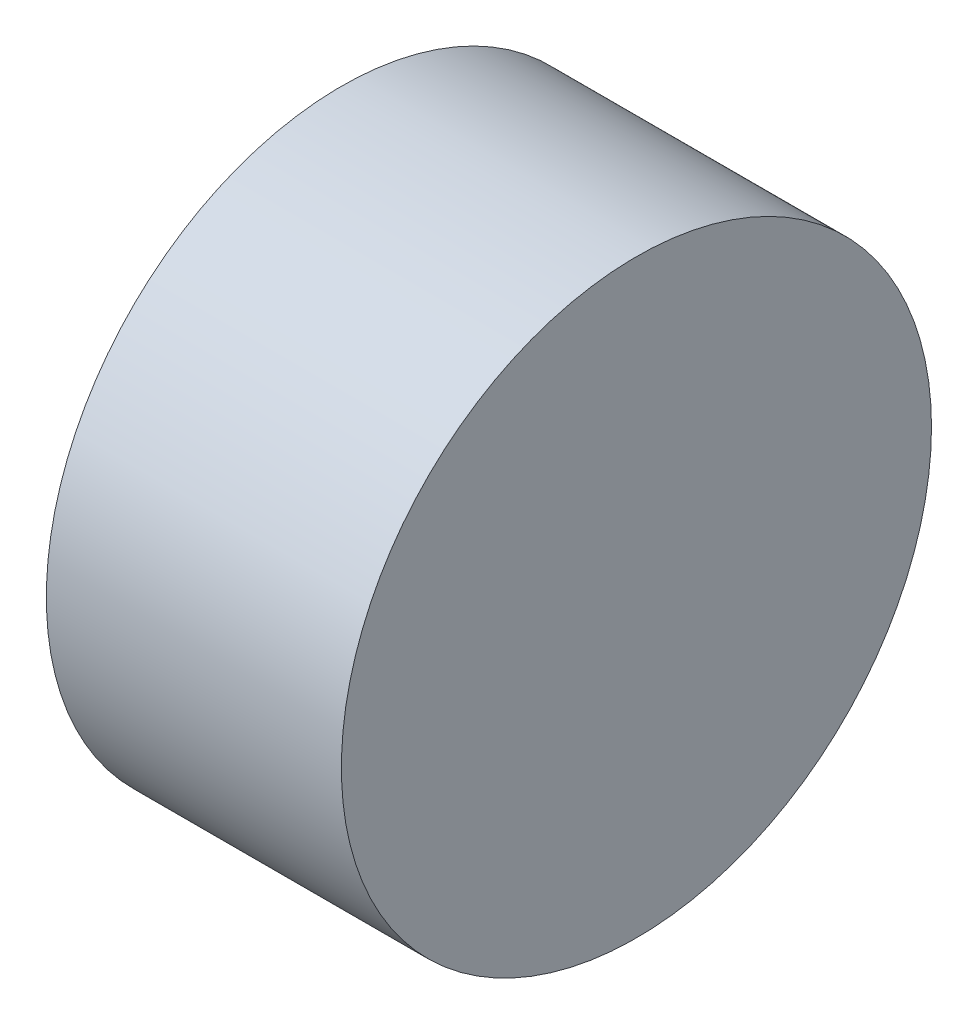
ISO-10303-21;
HEADER;
FILE_DESCRIPTION(('STEP AP214'),'2;1');
FILE_NAME('part.step','',(''),(''),'','','');
FILE_SCHEMA(('AUTOMOTIVE_DESIGN { 1 0 10303 214 1 1 1 1 }'));
ENDSEC;
DATA;
#1=APPLICATION_CONTEXT('core data for automotive mechanical design processes');
#2=APPLICATION_PROTOCOL_DEFINITION('international standard','automotive_design',2000,#1);
#3=PRODUCT_CONTEXT('',#1,'mechanical');
#4=PRODUCT('Part','Part','',(#3));
#5=PRODUCT_RELATED_PRODUCT_CATEGORY('part','',(#4));
#6=PRODUCT_DEFINITION_FORMATION('','',#4);
#7=PRODUCT_DEFINITION_CONTEXT('part definition',#1,'design');
#8=PRODUCT_DEFINITION('design','',#6,#7);
#9=PRODUCT_DEFINITION_SHAPE('','',#8);
#10=(LENGTH_UNIT() NAMED_UNIT(*) SI_UNIT(.MILLI.,.METRE.));
#11=(NAMED_UNIT(*) PLANE_ANGLE_UNIT() SI_UNIT($,.RADIAN.));
#12=(NAMED_UNIT(*) SI_UNIT($,.STERADIAN.) SOLID_ANGLE_UNIT());
#13=UNCERTAINTY_MEASURE_WITH_UNIT(LENGTH_MEASURE(1.E-05),#10,'distance_accuracy_value','');
#14=(GEOMETRIC_REPRESENTATION_CONTEXT(3) GLOBAL_UNCERTAINTY_ASSIGNED_CONTEXT((#13)) GLOBAL_UNIT_ASSIGNED_CONTEXT((#10,
#11,#12)) REPRESENTATION_CONTEXT('',''));
#15=CARTESIAN_POINT('',(0.,0.,0.));
#16=DIRECTION('',(0.,0.,1.));
#17=DIRECTION('',(1.,0.,0.));
#18=AXIS2_PLACEMENT_3D('',#15,#16,#17);
#19=CARTESIAN_POINT('',(30.,0.,0.));
#20=DIRECTION('',(-1.,0.,0.));
#21=DIRECTION('',(0.,0.,1.));
#22=AXIS2_PLACEMENT_3D('',#19,#20,#21);
#23=CYLINDRICAL_SURFACE('',#22,30.);
#24=CARTESIAN_POINT('',(30.,0.,0.));
#25=DIRECTION('',(1.,0.,0.));
#26=DIRECTION('',(0.,0.,-1.));
#27=AXIS2_PLACEMENT_3D('',#24,#25,#26);
#28=CIRCLE('',#27,30.);
#29=CARTESIAN_POINT('',(30.,0.,-30.));
#30=VERTEX_POINT('',#29);
#31=EDGE_CURVE('E13',#30,#30,#28,.T.);
#32=ORIENTED_EDGE('',*,*,#31,.F.);
#33=EDGE_LOOP('',(#32));
#34=FACE_BOUND('',#33,.T.);
#35=CARTESIAN_POINT('',(0.,0.,0.));
#36=DIRECTION('',(1.,0.,0.));
#37=DIRECTION('',(0.,0.,-1.));
#38=AXIS2_PLACEMENT_3D('',#35,#36,#37);
#39=CIRCLE('',#38,30.);
#40=CARTESIAN_POINT('',(0.,0.,-30.));
#41=VERTEX_POINT('',#40);
#42=EDGE_CURVE('E56',#41,#41,#39,.T.);
#43=ORIENTED_EDGE('',*,*,#42,.T.);
#44=EDGE_LOOP('',(#43));
#45=FACE_BOUND('',#44,.T.);
#46=ADVANCED_FACE('F53',(#34,#45),#23,.T.);
#47=CARTESIAN_POINT('',(30.,0.,0.));
#48=DIRECTION('',(1.,0.,0.));
#49=DIRECTION('',(0.,0.,-1.));
#50=AXIS2_PLACEMENT_3D('',#47,#48,#49);
#51=PLANE('',#50);
#52=ORIENTED_EDGE('',*,*,#31,.T.);
#53=EDGE_LOOP('',(#52));
#54=FACE_BOUND('',#53,.T.);
#55=ADVANCED_FACE('F197',(#54),#51,.T.);
#56=CARTESIAN_POINT('',(0.,0.,0.));
#57=DIRECTION('',(1.,0.,0.));
#58=DIRECTION('',(0.,0.,-1.));
#59=AXIS2_PLACEMENT_3D('',#56,#57,#58);
#60=PLANE('',#59);
#61=DIRECTION('',(0.,0.996206826942269,0.0870169980728876));
#62=VECTOR('',#61,1.);
#63=CARTESIAN_POINT('',(0.,-2.13552172082937,3.05074531547063));
#64=LINE('',#63,#62);
#65=CARTESIAN_POINT('',(0.,-2.13552172082937,3.05074531547063));
#66=VERTEX_POINT('',#65);
#67=CARTESIAN_POINT('',(0.,1.57426208325925,3.37478871830701));
#68=VERTEX_POINT('',#67);
#69=EDGE_CURVE('E148',#66,#68,#64,.T.);
#70=ORIENTED_EDGE('',*,*,#69,.F.);
#71=DIRECTION('',(0.,0.422744482578952,0.906248918591936));
#72=VECTOR('',#71,1.);
#73=CARTESIAN_POINT('',(0.,-3.70978380408862,-0.32404340283638));
#74=LINE('',#73,#72);
#75=CARTESIAN_POINT('',(0.,-3.70978380408862,-0.32404340283638));
#76=VERTEX_POINT('',#75);
#77=EDGE_CURVE('E68',#76,#66,#74,.T.);
#78=ORIENTED_EDGE('',*,*,#77,.F.);
#79=DIRECTION('',(0.,-0.573462344363316,0.819231920519049));
#80=VECTOR('',#79,1.);
#81=CARTESIAN_POINT('',(0.,-1.57426208325925,-3.37478871830701));
#82=LINE('',#81,#80);
#83=CARTESIAN_POINT('',(0.,-1.57426208325925,-3.37478871830701));
#84=VERTEX_POINT('',#83);
#85=EDGE_CURVE('E161',#84,#76,#82,.T.);
#86=ORIENTED_EDGE('',*,*,#85,.F.);
#87=DIRECTION('',(0.,-0.996206826942268,-0.0870169980728876));
#88=VECTOR('',#87,1.);
#89=CARTESIAN_POINT('',(0.,2.13552172082937,-3.05074531547062));
#90=LINE('',#89,#88);
#91=CARTESIAN_POINT('',(0.,2.13552172082937,-3.05074531547062));
#92=VERTEX_POINT('',#91);
#93=EDGE_CURVE('E158',#92,#84,#90,.T.);
#94=ORIENTED_EDGE('',*,*,#93,.F.);
#95=DIRECTION('',(0.,-0.422744482578952,-0.906248918591936));
#96=VECTOR('',#95,1.);
#97=CARTESIAN_POINT('',(0.,3.70978380408862,0.324043402836384));
#98=LINE('',#97,#96);
#99=CARTESIAN_POINT('',(0.,3.70978380408862,0.324043402836384));
#100=VERTEX_POINT('',#99);
#101=EDGE_CURVE('E116',#100,#92,#98,.T.);
#102=ORIENTED_EDGE('',*,*,#101,.F.);
#103=DIRECTION('',(0.,0.573462344363317,-0.819231920519049));
#104=VECTOR('',#103,1.);
#105=CARTESIAN_POINT('',(0.,1.57426208325925,3.37478871830701));
#106=LINE('',#105,#104);
#107=EDGE_CURVE('E152',#68,#100,#106,.T.);
#108=ORIENTED_EDGE('',*,*,#107,.F.);
#109=EDGE_LOOP('',(#70,#78,#86,#94,#102,#108));
#110=FACE_BOUND('',#109,.T.);
#111=ORIENTED_EDGE('',*,*,#42,.F.);
#112=EDGE_LOOP('',(#111));
#113=FACE_BOUND('',#112,.T.);
#114=ADVANCED_FACE('F180',(#110,#113),#60,.F.);
#115=CARTESIAN_POINT('',(10.,-3.70978380408862,-0.32404340283638));
#116=DIRECTION('',(0.,-0.906248918591936,0.422744482578952));
#117=DIRECTION('',(0.,-0.422744482578952,-0.906248918591936));
#118=AXIS2_PLACEMENT_3D('',#115,#116,#117);
#119=PLANE('',#118);
#120=ORIENTED_EDGE('',*,*,#77,.T.);
#121=DIRECTION('',(-1.,0.,0.));
#122=VECTOR('',#121,1.);
#123=CARTESIAN_POINT('',(10.,-2.13552172082937,3.05074531547063));
#124=LINE('',#123,#122);
#125=CARTESIAN_POINT('',(10.,-2.13552172082937,3.05074531547063));
#126=VERTEX_POINT('',#125);
#127=EDGE_CURVE('E98',#126,#66,#124,.T.);
#128=ORIENTED_EDGE('',*,*,#127,.F.);
#129=DIRECTION('',(0.,0.422744482578952,0.906248918591936));
#130=VECTOR('',#129,1.);
#131=CARTESIAN_POINT('',(10.,-3.70978380408862,-0.32404340283638));
#132=LINE('',#131,#130);
#133=CARTESIAN_POINT('',(10.,-3.70978380408862,-0.32404340283638));
#134=VERTEX_POINT('',#133);
#135=EDGE_CURVE('E164',#134,#126,#132,.T.);
#136=ORIENTED_EDGE('',*,*,#135,.F.);
#137=DIRECTION('',(-1.,0.,0.));
#138=VECTOR('',#137,1.);
#139=CARTESIAN_POINT('',(10.,-3.70978380408862,-0.32404340283638));
#140=LINE('',#139,#138);
#141=EDGE_CURVE('E76',#134,#76,#140,.T.);
#142=ORIENTED_EDGE('',*,*,#141,.T.);
#143=EDGE_LOOP('',(#120,#128,#136,#142));
#144=FACE_BOUND('',#143,.T.);
#145=ADVANCED_FACE('F188',(#144),#119,.F.);
#146=CARTESIAN_POINT('',(10.,-1.57426208325925,-3.37478871830701));
#147=DIRECTION('',(0.,-0.819231920519049,-0.573462344363316));
#148=DIRECTION('',(0.,0.573462344363316,-0.819231920519049));
#149=AXIS2_PLACEMENT_3D('',#146,#147,#148);
#150=PLANE('',#149);
#151=ORIENTED_EDGE('',*,*,#85,.T.);
#152=ORIENTED_EDGE('',*,*,#141,.F.);
#153=DIRECTION('',(0.,-0.573462344363316,0.819231920519049));
#154=VECTOR('',#153,1.);
#155=CARTESIAN_POINT('',(10.,-1.57426208325925,-3.37478871830701));
#156=LINE('',#155,#154);
#157=CARTESIAN_POINT('',(10.,-1.57426208325925,-3.37478871830701));
#158=VERTEX_POINT('',#157);
#159=EDGE_CURVE('E130',#158,#134,#156,.T.);
#160=ORIENTED_EDGE('',*,*,#159,.F.);
#161=DIRECTION('',(-1.,0.,0.));
#162=VECTOR('',#161,1.);
#163=CARTESIAN_POINT('',(10.,-1.57426208325925,-3.37478871830701));
#164=LINE('',#163,#162);
#165=EDGE_CURVE('E121',#158,#84,#164,.T.);
#166=ORIENTED_EDGE('',*,*,#165,.T.);
#167=EDGE_LOOP('',(#151,#152,#160,#166));
#168=FACE_BOUND('',#167,.T.);
#169=ADVANCED_FACE('F190',(#168),#150,.F.);
#170=CARTESIAN_POINT('',(10.,2.13552172082937,-3.05074531547062));
#171=DIRECTION('',(0.,0.0870169980728876,-0.996206826942269));
#172=DIRECTION('',(0.,0.996206826942269,0.0870169980728876));
#173=AXIS2_PLACEMENT_3D('',#170,#171,#172);
#174=PLANE('',#173);
#175=ORIENTED_EDGE('',*,*,#93,.T.);
#176=ORIENTED_EDGE('',*,*,#165,.F.);
#177=DIRECTION('',(0.,-0.996206826942268,-0.0870169980728876));
#178=VECTOR('',#177,1.);
#179=CARTESIAN_POINT('',(10.,2.13552172082937,-3.05074531547062));
#180=LINE('',#179,#178);
#181=CARTESIAN_POINT('',(10.,2.13552172082937,-3.05074531547062));
#182=VERTEX_POINT('',#181);
#183=EDGE_CURVE('E125',#182,#158,#180,.T.);
#184=ORIENTED_EDGE('',*,*,#183,.F.);
#185=DIRECTION('',(-1.,0.,0.));
#186=VECTOR('',#185,1.);
#187=CARTESIAN_POINT('',(10.,2.13552172082937,-3.05074531547062));
#188=LINE('',#187,#186);
#189=EDGE_CURVE('E109',#182,#92,#188,.T.);
#190=ORIENTED_EDGE('',*,*,#189,.T.);
#191=EDGE_LOOP('',(#175,#176,#184,#190));
#192=FACE_BOUND('',#191,.T.);
#193=ADVANCED_FACE('F126',(#192),#174,.F.);
#194=CARTESIAN_POINT('',(10.,3.70978380408862,0.324043402836384));
#195=DIRECTION('',(0.,0.906248918591936,-0.422744482578952));
#196=DIRECTION('',(0.,0.422744482578952,0.906248918591936));
#197=AXIS2_PLACEMENT_3D('',#194,#195,#196);
#198=PLANE('',#197);
#199=ORIENTED_EDGE('',*,*,#101,.T.);
#200=ORIENTED_EDGE('',*,*,#189,.F.);
#201=DIRECTION('',(0.,-0.422744482578952,-0.906248918591936));
#202=VECTOR('',#201,1.);
#203=CARTESIAN_POINT('',(10.,3.70978380408862,0.324043402836384));
#204=LINE('',#203,#202);
#205=CARTESIAN_POINT('',(10.,3.70978380408862,0.324043402836384));
#206=VERTEX_POINT('',#205);
#207=EDGE_CURVE('E113',#206,#182,#204,.T.);
#208=ORIENTED_EDGE('',*,*,#207,.F.);
#209=DIRECTION('',(-1.,0.,0.));
#210=VECTOR('',#209,1.);
#211=CARTESIAN_POINT('',(10.,3.70978380408862,0.324043402836384));
#212=LINE('',#211,#210);
#213=EDGE_CURVE('E122',#206,#100,#212,.T.);
#214=ORIENTED_EDGE('',*,*,#213,.T.);
#215=EDGE_LOOP('',(#199,#200,#208,#214));
#216=FACE_BOUND('',#215,.T.);
#217=ADVANCED_FACE('F111',(#216),#198,.F.);
#218=CARTESIAN_POINT('',(10.,1.57426208325925,3.37478871830701));
#219=DIRECTION('',(0.,0.819231920519049,0.573462344363317));
#220=DIRECTION('',(0.,-0.573462344363317,0.819231920519049));
#221=AXIS2_PLACEMENT_3D('',#218,#219,#220);
#222=PLANE('',#221);
#223=ORIENTED_EDGE('',*,*,#107,.T.);
#224=ORIENTED_EDGE('',*,*,#213,.F.);
#225=DIRECTION('',(0.,0.573462344363317,-0.819231920519049));
#226=VECTOR('',#225,1.);
#227=CARTESIAN_POINT('',(10.,1.57426208325925,3.37478871830701));
#228=LINE('',#227,#226);
#229=CARTESIAN_POINT('',(10.,1.57426208325925,3.37478871830701));
#230=VERTEX_POINT('',#229);
#231=EDGE_CURVE('E136',#230,#206,#228,.T.);
#232=ORIENTED_EDGE('',*,*,#231,.F.);
#233=DIRECTION('',(-1.,0.,0.));
#234=VECTOR('',#233,1.);
#235=CARTESIAN_POINT('',(10.,1.57426208325925,3.37478871830701));
#236=LINE('',#235,#234);
#237=EDGE_CURVE('E171',#230,#68,#236,.T.);
#238=ORIENTED_EDGE('',*,*,#237,.T.);
#239=EDGE_LOOP('',(#223,#224,#232,#238));
#240=FACE_BOUND('',#239,.T.);
#241=ADVANCED_FACE('F184',(#240),#222,.F.);
#242=CARTESIAN_POINT('',(10.,-2.13552172082937,3.05074531547063));
#243=DIRECTION('',(0.,-0.0870169980728876,0.996206826942269));
#244=DIRECTION('',(0.,-0.996206826942269,-0.0870169980728876));
#245=AXIS2_PLACEMENT_3D('',#242,#243,#244);
#246=PLANE('',#245);
#247=ORIENTED_EDGE('',*,*,#69,.T.);
#248=ORIENTED_EDGE('',*,*,#237,.F.);
#249=DIRECTION('',(0.,0.996206826942269,0.0870169980728876));
#250=VECTOR('',#249,1.);
#251=CARTESIAN_POINT('',(10.,-2.13552172082937,3.05074531547063));
#252=LINE('',#251,#250);
#253=EDGE_CURVE('E140',#126,#230,#252,.T.);
#254=ORIENTED_EDGE('',*,*,#253,.F.);
#255=ORIENTED_EDGE('',*,*,#127,.T.);
#256=EDGE_LOOP('',(#247,#248,#254,#255));
#257=FACE_BOUND('',#256,.T.);
#258=ADVANCED_FACE('F177',(#257),#246,.F.);
#259=CARTESIAN_POINT('',(10.,0.,0.));
#260=DIRECTION('',(-1.,0.,0.));
#261=DIRECTION('',(0.,0.,1.));
#262=AXIS2_PLACEMENT_3D('',#259,#260,#261);
#263=PLANE('',#262);
#264=ORIENTED_EDGE('',*,*,#135,.T.);
#265=ORIENTED_EDGE('',*,*,#253,.T.);
#266=ORIENTED_EDGE('',*,*,#231,.T.);
#267=ORIENTED_EDGE('',*,*,#207,.T.);
#268=ORIENTED_EDGE('',*,*,#183,.T.);
#269=ORIENTED_EDGE('',*,*,#159,.T.);
#270=EDGE_LOOP('',(#264,#265,#266,#267,#268,#269));
#271=FACE_BOUND('',#270,.T.);
#272=ADVANCED_FACE('F133',(#271),#263,.T.);
#273=CLOSED_SHELL('',(#46,#55,#114,#145,#169,#193,#217,#241,#258,#272));
#274=MANIFOLD_SOLID_BREP('B2',#273);
#275=ADVANCED_BREP_SHAPE_REPRESENTATION('',(#18,#274),#14);
#276=SHAPE_DEFINITION_REPRESENTATION(#9,#275);
ENDSEC;
END-ISO-10303-21;
